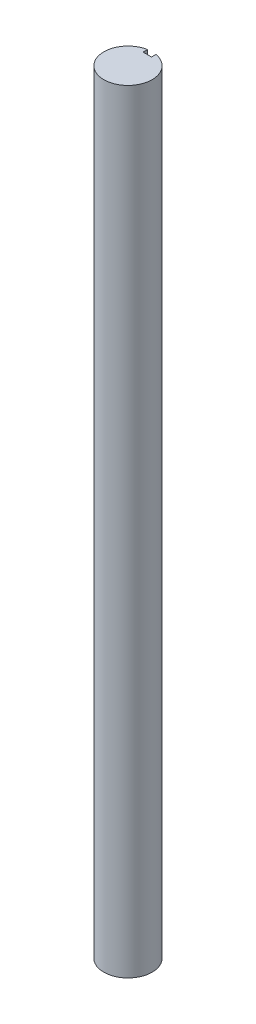
ISO-10303-21;
HEADER;
FILE_DESCRIPTION(('STEP AP214'),'2;1');
FILE_NAME('part.step','',(''),(''),'','','');
FILE_SCHEMA(('AUTOMOTIVE_DESIGN { 1 0 10303 214 1 1 1 1 }'));
ENDSEC;
DATA;
#1=APPLICATION_CONTEXT('core data for automotive mechanical design processes');
#2=APPLICATION_PROTOCOL_DEFINITION('international standard','automotive_design',2000,#1);
#3=PRODUCT_CONTEXT('',#1,'mechanical');
#4=PRODUCT('Part','Part','',(#3));
#5=PRODUCT_RELATED_PRODUCT_CATEGORY('part','',(#4));
#6=PRODUCT_DEFINITION_FORMATION('','',#4);
#7=PRODUCT_DEFINITION_CONTEXT('part definition',#1,'design');
#8=PRODUCT_DEFINITION('design','',#6,#7);
#9=PRODUCT_DEFINITION_SHAPE('','',#8);
#10=(LENGTH_UNIT() NAMED_UNIT(*) SI_UNIT(.MILLI.,.METRE.));
#11=(NAMED_UNIT(*) PLANE_ANGLE_UNIT() SI_UNIT($,.RADIAN.));
#12=(NAMED_UNIT(*) SI_UNIT($,.STERADIAN.) SOLID_ANGLE_UNIT());
#13=UNCERTAINTY_MEASURE_WITH_UNIT(LENGTH_MEASURE(1.E-05),#10,'distance_accuracy_value','');
#14=(GEOMETRIC_REPRESENTATION_CONTEXT(3) GLOBAL_UNCERTAINTY_ASSIGNED_CONTEXT((#13)) GLOBAL_UNIT_ASSIGNED_CONTEXT((#10,
#11,#12)) REPRESENTATION_CONTEXT('',''));
#15=CARTESIAN_POINT('',(0.,0.,0.));
#16=DIRECTION('',(0.,0.,1.));
#17=DIRECTION('',(1.,0.,0.));
#18=AXIS2_PLACEMENT_3D('',#15,#16,#17);
#19=CARTESIAN_POINT('',(0.,160.,0.));
#20=DIRECTION('',(0.,-1.,0.));
#21=DIRECTION('',(0.,0.,-1.));
#22=AXIS2_PLACEMENT_3D('',#19,#20,#21);
#23=CYLINDRICAL_SURFACE('',#22,10.);
#24=CARTESIAN_POINT('',(0.,120.,0.));
#25=DIRECTION('',(0.,-1.,0.));
#26=DIRECTION('',(0.,0.,-1.));
#27=AXIS2_PLACEMENT_3D('',#24,#25,#26);
#28=CIRCLE('',#27,10.);
#29=CARTESIAN_POINT('',(-1.75,120.,-9.84568433375762));
#30=VERTEX_POINT('',#29);
#31=CARTESIAN_POINT('',(1.75,120.,-9.84568433375762));
#32=VERTEX_POINT('',#31);
#33=EDGE_CURVE('E11',#30,#32,#28,.T.);
#34=ORIENTED_EDGE('',*,*,#33,.T.);
#35=DIRECTION('',(0.,-1.,0.));
#36=VECTOR('',#35,1.);
#37=CARTESIAN_POINT('',(1.75,160.,-9.84568433375762));
#38=LINE('',#37,#36);
#39=CARTESIAN_POINT('',(1.75,160.,-9.84568433375762));
#40=VERTEX_POINT('',#39);
#41=EDGE_CURVE('E55',#32,#40,#38,.F.);
#42=ORIENTED_EDGE('',*,*,#41,.T.);
#43=CARTESIAN_POINT('',(0.,160.,0.));
#44=DIRECTION('',(0.,1.,0.));
#45=DIRECTION('',(0.,0.,1.));
#46=AXIS2_PLACEMENT_3D('',#43,#44,#45);
#47=CIRCLE('',#46,10.);
#48=CARTESIAN_POINT('',(-1.75,160.,-9.84568433375762));
#49=VERTEX_POINT('',#48);
#50=EDGE_CURVE('E101',#49,#40,#47,.T.);
#51=ORIENTED_EDGE('',*,*,#50,.F.);
#52=DIRECTION('',(0.,-1.,0.));
#53=VECTOR('',#52,1.);
#54=CARTESIAN_POINT('',(-1.75,160.,-9.84568433375762));
#55=LINE('',#54,#53);
#56=EDGE_CURVE('E47',#49,#30,#55,.T.);
#57=ORIENTED_EDGE('',*,*,#56,.T.);
#58=EDGE_LOOP('',(#34,#42,#51,#57));
#59=FACE_BOUND('',#58,.T.);
#60=CARTESIAN_POINT('',(0.,-160.,0.));
#61=DIRECTION('',(0.,1.,0.));
#62=DIRECTION('',(0.,0.,1.));
#63=AXIS2_PLACEMENT_3D('',#60,#61,#62);
#64=CIRCLE('',#63,10.);
#65=CARTESIAN_POINT('',(0.,-160.,10.));
#66=VERTEX_POINT('',#65);
#67=EDGE_CURVE('E100',#66,#66,#64,.T.);
#68=ORIENTED_EDGE('',*,*,#67,.T.);
#69=EDGE_LOOP('',(#68));
#70=FACE_BOUND('',#69,.T.);
#71=ADVANCED_FACE('F33',(#59,#70),#23,.T.);
#72=CARTESIAN_POINT('',(0.,160.,0.));
#73=DIRECTION('',(0.,1.,0.));
#74=DIRECTION('',(0.,0.,1.));
#75=AXIS2_PLACEMENT_3D('',#72,#73,#74);
#76=PLANE('',#75);
#77=DIRECTION('',(0.,0.,-1.));
#78=VECTOR('',#77,1.);
#79=CARTESIAN_POINT('',(1.75,160.,-11.1473109549469));
#80=LINE('',#79,#78);
#81=CARTESIAN_POINT('',(1.75,160.,-8.00000000000001));
#82=VERTEX_POINT('',#81);
#83=EDGE_CURVE('E79',#82,#40,#80,.T.);
#84=ORIENTED_EDGE('',*,*,#83,.F.);
#85=DIRECTION('',(1.,0.,0.));
#86=VECTOR('',#85,1.);
#87=CARTESIAN_POINT('',(-1.75,160.,-8.00000000000001));
#88=LINE('',#87,#86);
#89=CARTESIAN_POINT('',(-1.75,160.,-8.00000000000001));
#90=VERTEX_POINT('',#89);
#91=EDGE_CURVE('E94',#90,#82,#88,.T.);
#92=ORIENTED_EDGE('',*,*,#91,.F.);
#93=DIRECTION('',(0.,0.,1.));
#94=VECTOR('',#93,1.);
#95=CARTESIAN_POINT('',(-1.75,160.,0.));
#96=LINE('',#95,#94);
#97=EDGE_CURVE('E40',#49,#90,#96,.T.);
#98=ORIENTED_EDGE('',*,*,#97,.F.);
#99=ORIENTED_EDGE('',*,*,#50,.T.);
#100=EDGE_LOOP('',(#84,#92,#98,#99));
#101=FACE_BOUND('',#100,.T.);
#102=ADVANCED_FACE('F110',(#101),#76,.T.);
#103=CARTESIAN_POINT('',(0.,-160.,0.));
#104=DIRECTION('',(0.,1.,0.));
#105=DIRECTION('',(0.,0.,1.));
#106=AXIS2_PLACEMENT_3D('',#103,#104,#105);
#107=PLANE('',#106);
#108=ORIENTED_EDGE('',*,*,#67,.F.);
#109=EDGE_LOOP('',(#108));
#110=FACE_BOUND('',#109,.T.);
#111=ADVANCED_FACE('F108',(#110),#107,.F.);
#112=CARTESIAN_POINT('',(0.,120.,0.));
#113=DIRECTION('',(0.,-1.,0.));
#114=DIRECTION('',(0.,0.,-1.));
#115=AXIS2_PLACEMENT_3D('',#112,#113,#114);
#116=PLANE('',#115);
#117=DIRECTION('',(0.,0.,1.));
#118=VECTOR('',#117,1.);
#119=CARTESIAN_POINT('',(-1.75,120.,-9.84568433375762));
#120=LINE('',#119,#118);
#121=CARTESIAN_POINT('',(-1.75,120.,-8.00000000000001));
#122=VERTEX_POINT('',#121);
#123=EDGE_CURVE('E74',#30,#122,#120,.T.);
#124=ORIENTED_EDGE('',*,*,#123,.T.);
#125=DIRECTION('',(1.,0.,0.));
#126=VECTOR('',#125,1.);
#127=CARTESIAN_POINT('',(-1.75,120.,-8.00000000000001));
#128=LINE('',#127,#126);
#129=CARTESIAN_POINT('',(1.75,120.,-8.00000000000001));
#130=VERTEX_POINT('',#129);
#131=EDGE_CURVE('E78',#122,#130,#128,.T.);
#132=ORIENTED_EDGE('',*,*,#131,.T.);
#133=DIRECTION('',(0.,0.,-1.));
#134=VECTOR('',#133,1.);
#135=CARTESIAN_POINT('',(1.75,120.,-8.00000000000001));
#136=LINE('',#135,#134);
#137=EDGE_CURVE('E88',#130,#32,#136,.T.);
#138=ORIENTED_EDGE('',*,*,#137,.T.);
#139=ORIENTED_EDGE('',*,*,#33,.F.);
#140=EDGE_LOOP('',(#124,#132,#138,#139));
#141=FACE_BOUND('',#140,.T.);
#142=ADVANCED_FACE('F76',(#141),#116,.F.);
#143=CARTESIAN_POINT('',(1.75,120.,-11.1473109549469));
#144=DIRECTION('',(1.,0.,0.));
#145=DIRECTION('',(0.,0.,-1.));
#146=AXIS2_PLACEMENT_3D('',#143,#144,#145);
#147=PLANE('',#146);
#148=ORIENTED_EDGE('',*,*,#137,.F.);
#149=DIRECTION('',(0.,1.,0.));
#150=VECTOR('',#149,1.);
#151=CARTESIAN_POINT('',(1.75,120.,-8.00000000000001));
#152=LINE('',#151,#150);
#153=EDGE_CURVE('E87',#130,#82,#152,.T.);
#154=ORIENTED_EDGE('',*,*,#153,.T.);
#155=ORIENTED_EDGE('',*,*,#83,.T.);
#156=ORIENTED_EDGE('',*,*,#41,.F.);
#157=EDGE_LOOP('',(#148,#154,#155,#156));
#158=FACE_BOUND('',#157,.T.);
#159=ADVANCED_FACE('F115',(#158),#147,.F.);
#160=CARTESIAN_POINT('',(-1.75,120.,-9.84568433375762));
#161=DIRECTION('',(-1.,0.,0.));
#162=DIRECTION('',(0.,0.,1.));
#163=AXIS2_PLACEMENT_3D('',#160,#161,#162);
#164=PLANE('',#163);
#165=ORIENTED_EDGE('',*,*,#97,.T.);
#166=DIRECTION('',(0.,1.,0.));
#167=VECTOR('',#166,1.);
#168=CARTESIAN_POINT('',(-1.75,120.,-8.00000000000001));
#169=LINE('',#168,#167);
#170=EDGE_CURVE('E82',#122,#90,#169,.T.);
#171=ORIENTED_EDGE('',*,*,#170,.F.);
#172=ORIENTED_EDGE('',*,*,#123,.F.);
#173=ORIENTED_EDGE('',*,*,#56,.F.);
#174=EDGE_LOOP('',(#165,#171,#172,#173));
#175=FACE_BOUND('',#174,.T.);
#176=ADVANCED_FACE('F83',(#175),#164,.F.);
#177=CARTESIAN_POINT('',(-1.75,120.,-8.00000000000001));
#178=DIRECTION('',(0.,0.,1.));
#179=DIRECTION('',(1.,0.,0.));
#180=AXIS2_PLACEMENT_3D('',#177,#178,#179);
#181=PLANE('',#180);
#182=ORIENTED_EDGE('',*,*,#91,.T.);
#183=ORIENTED_EDGE('',*,*,#153,.F.);
#184=ORIENTED_EDGE('',*,*,#131,.F.);
#185=ORIENTED_EDGE('',*,*,#170,.T.);
#186=EDGE_LOOP('',(#182,#183,#184,#185));
#187=FACE_BOUND('',#186,.T.);
#188=ADVANCED_FACE('F90',(#187),#181,.F.);
#189=CLOSED_SHELL('',(#71,#102,#111,#142,#159,#176,#188));
#190=MANIFOLD_SOLID_BREP('B2',#189);
#191=ADVANCED_BREP_SHAPE_REPRESENTATION('',(#18,#190),#14);
#192=SHAPE_DEFINITION_REPRESENTATION(#9,#191);
ENDSEC;
END-ISO-10303-21;
